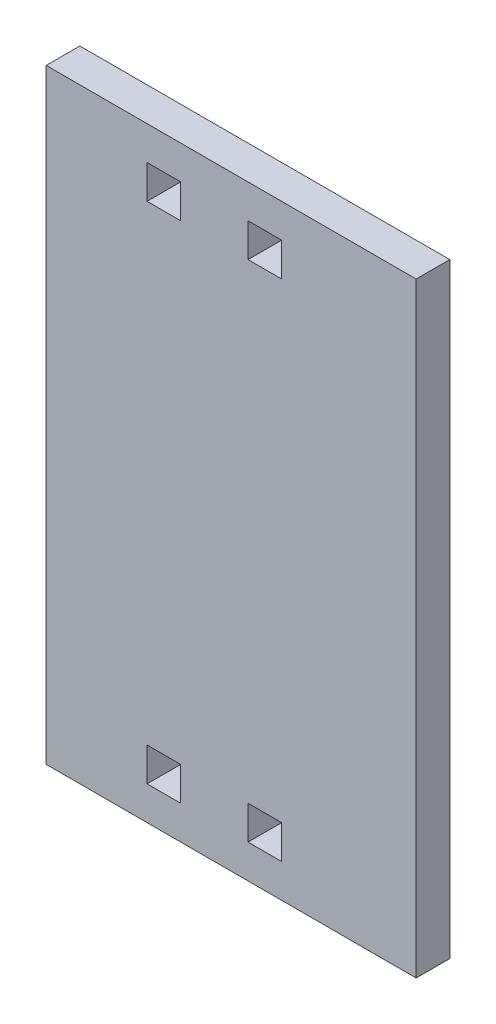
ISO-10303-21;
HEADER;
FILE_DESCRIPTION(('STEP AP214'),'2;1');
FILE_NAME('part.step','',(''),(''),'','','');
FILE_SCHEMA(('AUTOMOTIVE_DESIGN { 1 0 10303 214 1 1 1 1 }'));
ENDSEC;
DATA;
#1=APPLICATION_CONTEXT('core data for automotive mechanical design processes');
#2=APPLICATION_PROTOCOL_DEFINITION('international standard','automotive_design',2000,#1);
#3=PRODUCT_CONTEXT('',#1,'mechanical');
#4=PRODUCT('Part','Part','',(#3));
#5=PRODUCT_RELATED_PRODUCT_CATEGORY('part','',(#4));
#6=PRODUCT_DEFINITION_FORMATION('','',#4);
#7=PRODUCT_DEFINITION_CONTEXT('part definition',#1,'design');
#8=PRODUCT_DEFINITION('design','',#6,#7);
#9=PRODUCT_DEFINITION_SHAPE('','',#8);
#10=(LENGTH_UNIT() NAMED_UNIT(*) SI_UNIT(.MILLI.,.METRE.));
#11=(NAMED_UNIT(*) PLANE_ANGLE_UNIT() SI_UNIT($,.RADIAN.));
#12=(NAMED_UNIT(*) SI_UNIT($,.STERADIAN.) SOLID_ANGLE_UNIT());
#13=UNCERTAINTY_MEASURE_WITH_UNIT(LENGTH_MEASURE(1.E-05),#10,'distance_accuracy_value','');
#14=(GEOMETRIC_REPRESENTATION_CONTEXT(3) GLOBAL_UNCERTAINTY_ASSIGNED_CONTEXT((#13)) GLOBAL_UNIT_ASSIGNED_CONTEXT((#10,
#11,#12)) REPRESENTATION_CONTEXT('',''));
#15=CARTESIAN_POINT('',(0.,0.,0.));
#16=DIRECTION('',(0.,0.,1.));
#17=DIRECTION('',(1.,0.,0.));
#18=AXIS2_PLACEMENT_3D('',#15,#16,#17);
#19=CARTESIAN_POINT('',(0.,72.5,5.));
#20=DIRECTION('',(0.,-1.,0.));
#21=DIRECTION('',(0.,0.,-1.));
#22=AXIS2_PLACEMENT_3D('',#19,#20,#21);
#23=PLANE('',#22);
#24=DIRECTION('',(-1.,0.,0.));
#25=VECTOR('',#24,1.);
#26=CARTESIAN_POINT('',(0.,72.5,0.));
#27=LINE('',#26,#25);
#28=CARTESIAN_POINT('',(-5.,72.5,0.));
#29=VERTEX_POINT('',#28);
#30=CARTESIAN_POINT('',(-10.,72.5,0.));
#31=VERTEX_POINT('',#30);
#32=EDGE_CURVE('E254',#29,#31,#27,.T.);
#33=ORIENTED_EDGE('',*,*,#32,.T.);
#34=DIRECTION('',(0.,0.,-1.));
#35=VECTOR('',#34,1.);
#36=CARTESIAN_POINT('',(-10.,72.5,5.));
#37=LINE('',#36,#35);
#38=CARTESIAN_POINT('',(-10.,72.5,5.));
#39=VERTEX_POINT('',#38);
#40=EDGE_CURVE('E11',#39,#31,#37,.T.);
#41=ORIENTED_EDGE('',*,*,#40,.F.);
#42=DIRECTION('',(-1.,0.,0.));
#43=VECTOR('',#42,1.);
#44=CARTESIAN_POINT('',(0.,72.5,5.));
#45=LINE('',#44,#43);
#46=CARTESIAN_POINT('',(-5.,72.5,5.));
#47=VERTEX_POINT('',#46);
#48=EDGE_CURVE('E190',#47,#39,#45,.T.);
#49=ORIENTED_EDGE('',*,*,#48,.F.);
#50=DIRECTION('',(0.,0.,-1.));
#51=VECTOR('',#50,1.);
#52=CARTESIAN_POINT('',(-5.,72.5,5.));
#53=LINE('',#52,#51);
#54=EDGE_CURVE('E58',#47,#29,#53,.T.);
#55=ORIENTED_EDGE('',*,*,#54,.T.);
#56=EDGE_LOOP('',(#33,#41,#49,#55));
#57=FACE_BOUND('',#56,.T.);
#58=ADVANCED_FACE('F39',(#57),#23,.F.);
#59=CARTESIAN_POINT('',(-10.,0.,5.));
#60=DIRECTION('',(-1.,0.,0.));
#61=DIRECTION('',(0.,0.,1.));
#62=AXIS2_PLACEMENT_3D('',#59,#60,#61);
#63=PLANE('',#62);
#64=DIRECTION('',(0.,1.,0.));
#65=VECTOR('',#64,1.);
#66=CARTESIAN_POINT('',(-10.,0.,0.));
#67=LINE('',#66,#65);
#68=CARTESIAN_POINT('',(-10.,77.5,0.));
#69=VERTEX_POINT('',#68);
#70=EDGE_CURVE('E196',#31,#69,#67,.T.);
#71=ORIENTED_EDGE('',*,*,#70,.T.);
#72=DIRECTION('',(0.,0.,-1.));
#73=VECTOR('',#72,1.);
#74=CARTESIAN_POINT('',(-10.,77.5,5.));
#75=LINE('',#74,#73);
#76=CARTESIAN_POINT('',(-10.,77.5,5.));
#77=VERTEX_POINT('',#76);
#78=EDGE_CURVE('E49',#77,#69,#75,.T.);
#79=ORIENTED_EDGE('',*,*,#78,.F.);
#80=DIRECTION('',(0.,1.,0.));
#81=VECTOR('',#80,1.);
#82=CARTESIAN_POINT('',(-10.,0.,5.));
#83=LINE('',#82,#81);
#84=EDGE_CURVE('E184',#39,#77,#83,.T.);
#85=ORIENTED_EDGE('',*,*,#84,.F.);
#86=ORIENTED_EDGE('',*,*,#40,.T.);
#87=EDGE_LOOP('',(#71,#79,#85,#86));
#88=FACE_BOUND('',#87,.T.);
#89=ADVANCED_FACE('F195',(#88),#63,.F.);
#90=CARTESIAN_POINT('',(0.,77.5,5.));
#91=DIRECTION('',(0.,-1.,0.));
#92=DIRECTION('',(0.,0.,-1.));
#93=AXIS2_PLACEMENT_3D('',#90,#91,#92);
#94=PLANE('',#93);
#95=DIRECTION('',(-1.,0.,0.));
#96=VECTOR('',#95,1.);
#97=CARTESIAN_POINT('',(0.,77.5,0.));
#98=LINE('',#97,#96);
#99=CARTESIAN_POINT('',(-5.,77.5,0.));
#100=VERTEX_POINT('',#99);
#101=EDGE_CURVE('E257',#100,#69,#98,.T.);
#102=ORIENTED_EDGE('',*,*,#101,.F.);
#103=DIRECTION('',(0.,0.,-1.));
#104=VECTOR('',#103,1.);
#105=CARTESIAN_POINT('',(-5.,77.5,5.));
#106=LINE('',#105,#104);
#107=CARTESIAN_POINT('',(-5.,77.5,5.));
#108=VERTEX_POINT('',#107);
#109=EDGE_CURVE('E120',#108,#100,#106,.T.);
#110=ORIENTED_EDGE('',*,*,#109,.F.);
#111=DIRECTION('',(-1.,0.,0.));
#112=VECTOR('',#111,1.);
#113=CARTESIAN_POINT('',(0.,77.5,5.));
#114=LINE('',#113,#112);
#115=EDGE_CURVE('E189',#108,#77,#114,.T.);
#116=ORIENTED_EDGE('',*,*,#115,.T.);
#117=ORIENTED_EDGE('',*,*,#78,.T.);
#118=EDGE_LOOP('',(#102,#110,#116,#117));
#119=FACE_BOUND('',#118,.T.);
#120=ADVANCED_FACE('F200',(#119),#94,.T.);
#121=CARTESIAN_POINT('',(0.,2.5,5.));
#122=DIRECTION('',(0.,1.,0.));
#123=DIRECTION('',(0.,0.,1.));
#124=AXIS2_PLACEMENT_3D('',#121,#122,#123);
#125=PLANE('',#124);
#126=DIRECTION('',(1.,0.,0.));
#127=VECTOR('',#126,1.);
#128=CARTESIAN_POINT('',(0.,2.5,0.));
#129=LINE('',#128,#127);
#130=CARTESIAN_POINT('',(5.,2.5,0.));
#131=VERTEX_POINT('',#130);
#132=CARTESIAN_POINT('',(10.,2.5,0.));
#133=VERTEX_POINT('',#132);
#134=EDGE_CURVE('E242',#131,#133,#129,.T.);
#135=ORIENTED_EDGE('',*,*,#134,.T.);
#136=DIRECTION('',(0.,0.,-1.));
#137=VECTOR('',#136,1.);
#138=CARTESIAN_POINT('',(10.,2.5,5.));
#139=LINE('',#138,#137);
#140=CARTESIAN_POINT('',(10.,2.5,5.));
#141=VERTEX_POINT('',#140);
#142=EDGE_CURVE('E264',#141,#133,#139,.T.);
#143=ORIENTED_EDGE('',*,*,#142,.F.);
#144=DIRECTION('',(1.,0.,0.));
#145=VECTOR('',#144,1.);
#146=CARTESIAN_POINT('',(0.,2.5,5.));
#147=LINE('',#146,#145);
#148=CARTESIAN_POINT('',(5.,2.5,5.));
#149=VERTEX_POINT('',#148);
#150=EDGE_CURVE('E343',#149,#141,#147,.T.);
#151=ORIENTED_EDGE('',*,*,#150,.F.);
#152=DIRECTION('',(0.,0.,-1.));
#153=VECTOR('',#152,1.);
#154=CARTESIAN_POINT('',(5.,2.5,5.));
#155=LINE('',#154,#153);
#156=EDGE_CURVE('E266',#149,#131,#155,.T.);
#157=ORIENTED_EDGE('',*,*,#156,.T.);
#158=EDGE_LOOP('',(#135,#143,#151,#157));
#159=FACE_BOUND('',#158,.T.);
#160=ADVANCED_FACE('F369',(#159),#125,.F.);
#161=CARTESIAN_POINT('',(10.,0.,5.));
#162=DIRECTION('',(1.,0.,0.));
#163=DIRECTION('',(0.,0.,-1.));
#164=AXIS2_PLACEMENT_3D('',#161,#162,#163);
#165=PLANE('',#164);
#166=DIRECTION('',(0.,-1.,0.));
#167=VECTOR('',#166,1.);
#168=CARTESIAN_POINT('',(10.,0.,0.));
#169=LINE('',#168,#167);
#170=CARTESIAN_POINT('',(10.,-2.5,0.));
#171=VERTEX_POINT('',#170);
#172=EDGE_CURVE('E245',#133,#171,#169,.T.);
#173=ORIENTED_EDGE('',*,*,#172,.T.);
#174=DIRECTION('',(0.,0.,-1.));
#175=VECTOR('',#174,1.);
#176=CARTESIAN_POINT('',(10.,-2.5,5.));
#177=LINE('',#176,#175);
#178=CARTESIAN_POINT('',(10.,-2.5,5.));
#179=VERTEX_POINT('',#178);
#180=EDGE_CURVE('E271',#179,#171,#177,.T.);
#181=ORIENTED_EDGE('',*,*,#180,.F.);
#182=DIRECTION('',(0.,-1.,0.));
#183=VECTOR('',#182,1.);
#184=CARTESIAN_POINT('',(10.,0.,5.));
#185=LINE('',#184,#183);
#186=EDGE_CURVE('E346',#141,#179,#185,.T.);
#187=ORIENTED_EDGE('',*,*,#186,.F.);
#188=ORIENTED_EDGE('',*,*,#142,.T.);
#189=EDGE_LOOP('',(#173,#181,#187,#188));
#190=FACE_BOUND('',#189,.T.);
#191=ADVANCED_FACE('F371',(#190),#165,.F.);
#192=CARTESIAN_POINT('',(0.,-2.5,5.));
#193=DIRECTION('',(0.,1.,0.));
#194=DIRECTION('',(0.,0.,1.));
#195=AXIS2_PLACEMENT_3D('',#192,#193,#194);
#196=PLANE('',#195);
#197=DIRECTION('',(1.,0.,0.));
#198=VECTOR('',#197,1.);
#199=CARTESIAN_POINT('',(0.,-2.5,0.));
#200=LINE('',#199,#198);
#201=CARTESIAN_POINT('',(5.,-2.5,0.));
#202=VERTEX_POINT('',#201);
#203=EDGE_CURVE('E248',#202,#171,#200,.T.);
#204=ORIENTED_EDGE('',*,*,#203,.F.);
#205=DIRECTION('',(0.,0.,-1.));
#206=VECTOR('',#205,1.);
#207=CARTESIAN_POINT('',(5.,-2.5,5.));
#208=LINE('',#207,#206);
#209=CARTESIAN_POINT('',(5.,-2.5,5.));
#210=VERTEX_POINT('',#209);
#211=EDGE_CURVE('E268',#210,#202,#208,.T.);
#212=ORIENTED_EDGE('',*,*,#211,.F.);
#213=DIRECTION('',(1.,0.,0.));
#214=VECTOR('',#213,1.);
#215=CARTESIAN_POINT('',(0.,-2.5,5.));
#216=LINE('',#215,#214);
#217=EDGE_CURVE('E348',#210,#179,#216,.T.);
#218=ORIENTED_EDGE('',*,*,#217,.T.);
#219=ORIENTED_EDGE('',*,*,#180,.T.);
#220=EDGE_LOOP('',(#204,#212,#218,#219));
#221=FACE_BOUND('',#220,.T.);
#222=ADVANCED_FACE('F364',(#221),#196,.T.);
#223=CARTESIAN_POINT('',(0.,-7.5,5.));
#224=DIRECTION('',(0.,-1.,0.));
#225=DIRECTION('',(1.,0.,0.));
#226=AXIS2_PLACEMENT_3D('',#223,#224,#225);
#227=PLANE('',#226);
#228=DIRECTION('',(-1.,0.,0.));
#229=VECTOR('',#228,1.);
#230=CARTESIAN_POINT('',(0.,-7.5,0.));
#231=LINE('',#230,#229);
#232=CARTESIAN_POINT('',(30.,-7.5,0.));
#233=VERTEX_POINT('',#232);
#234=CARTESIAN_POINT('',(-25.,-7.50000000000001,0.));
#235=VERTEX_POINT('',#234);
#236=EDGE_CURVE('E230',#233,#235,#231,.T.);
#237=ORIENTED_EDGE('',*,*,#236,.F.);
#238=DIRECTION('',(0.,0.,-1.));
#239=VECTOR('',#238,1.);
#240=CARTESIAN_POINT('',(30.,-7.5,5.));
#241=LINE('',#240,#239);
#242=CARTESIAN_POINT('',(30.,-7.5,5.));
#243=VERTEX_POINT('',#242);
#244=EDGE_CURVE('E269',#243,#233,#241,.T.);
#245=ORIENTED_EDGE('',*,*,#244,.F.);
#246=DIRECTION('',(-1.,0.,0.));
#247=VECTOR('',#246,1.);
#248=CARTESIAN_POINT('',(0.,-7.5,5.));
#249=LINE('',#248,#247);
#250=CARTESIAN_POINT('',(-25.,-7.50000000000001,5.));
#251=VERTEX_POINT('',#250);
#252=EDGE_CURVE('E332',#243,#251,#249,.T.);
#253=ORIENTED_EDGE('',*,*,#252,.T.);
#254=DIRECTION('',(0.,0.,-1.));
#255=VECTOR('',#254,1.);
#256=CARTESIAN_POINT('',(-25.,-7.50000000000001,5.));
#257=LINE('',#256,#255);
#258=EDGE_CURVE('E275',#251,#235,#257,.T.);
#259=ORIENTED_EDGE('',*,*,#258,.T.);
#260=EDGE_LOOP('',(#237,#245,#253,#259));
#261=FACE_BOUND('',#260,.T.);
#262=ADVANCED_FACE('F378',(#261),#227,.T.);
#263=CARTESIAN_POINT('',(30.,0.,5.));
#264=DIRECTION('',(1.,0.,0.));
#265=DIRECTION('',(0.,0.,-1.));
#266=AXIS2_PLACEMENT_3D('',#263,#264,#265);
#267=PLANE('',#266);
#268=DIRECTION('',(0.,-1.,0.));
#269=VECTOR('',#268,1.);
#270=CARTESIAN_POINT('',(30.,0.,0.));
#271=LINE('',#270,#269);
#272=CARTESIAN_POINT('',(30.,82.5,0.));
#273=VERTEX_POINT('',#272);
#274=EDGE_CURVE('E233',#273,#233,#271,.T.);
#275=ORIENTED_EDGE('',*,*,#274,.F.);
#276=DIRECTION('',(0.,0.,-1.));
#277=VECTOR('',#276,1.);
#278=CARTESIAN_POINT('',(30.,82.5,5.));
#279=LINE('',#278,#277);
#280=CARTESIAN_POINT('',(30.,82.5,5.));
#281=VERTEX_POINT('',#280);
#282=EDGE_CURVE('E280',#281,#273,#279,.T.);
#283=ORIENTED_EDGE('',*,*,#282,.F.);
#284=DIRECTION('',(0.,-1.,0.));
#285=VECTOR('',#284,1.);
#286=CARTESIAN_POINT('',(30.,0.,5.));
#287=LINE('',#286,#285);
#288=EDGE_CURVE('E335',#281,#243,#287,.T.);
#289=ORIENTED_EDGE('',*,*,#288,.T.);
#290=ORIENTED_EDGE('',*,*,#244,.T.);
#291=EDGE_LOOP('',(#275,#283,#289,#290));
#292=FACE_BOUND('',#291,.T.);
#293=ADVANCED_FACE('F424',(#292),#267,.T.);
#294=CARTESIAN_POINT('',(0.,82.5,5.));
#295=DIRECTION('',(0.,1.,0.));
#296=DIRECTION('',(0.,0.,1.));
#297=AXIS2_PLACEMENT_3D('',#294,#295,#296);
#298=PLANE('',#297);
#299=DIRECTION('',(1.,0.,0.));
#300=VECTOR('',#299,1.);
#301=CARTESIAN_POINT('',(0.,82.5,0.));
#302=LINE('',#301,#300);
#303=CARTESIAN_POINT('',(-25.,82.5,0.));
#304=VERTEX_POINT('',#303);
#305=EDGE_CURVE('E236',#304,#273,#302,.T.);
#306=ORIENTED_EDGE('',*,*,#305,.F.);
#307=DIRECTION('',(0.,0.,-1.));
#308=VECTOR('',#307,1.);
#309=CARTESIAN_POINT('',(-25.,82.5,5.));
#310=LINE('',#309,#308);
#311=CARTESIAN_POINT('',(-25.,82.5,5.));
#312=VERTEX_POINT('',#311);
#313=EDGE_CURVE('E277',#312,#304,#310,.T.);
#314=ORIENTED_EDGE('',*,*,#313,.F.);
#315=DIRECTION('',(1.,0.,0.));
#316=VECTOR('',#315,1.);
#317=CARTESIAN_POINT('',(0.,82.5,5.));
#318=LINE('',#317,#316);
#319=EDGE_CURVE('E338',#312,#281,#318,.T.);
#320=ORIENTED_EDGE('',*,*,#319,.T.);
#321=ORIENTED_EDGE('',*,*,#282,.T.);
#322=EDGE_LOOP('',(#306,#314,#320,#321));
#323=FACE_BOUND('',#322,.T.);
#324=ADVANCED_FACE('F410',(#323),#298,.T.);
#325=CARTESIAN_POINT('',(-10.,0.,5.));
#326=DIRECTION('',(1.,0.,0.));
#327=DIRECTION('',(0.,0.,-1.));
#328=AXIS2_PLACEMENT_3D('',#325,#326,#327);
#329=PLANE('',#328);
#330=DIRECTION('',(0.,-1.,0.));
#331=VECTOR('',#330,1.);
#332=CARTESIAN_POINT('',(-10.,0.,0.));
#333=LINE('',#332,#331);
#334=CARTESIAN_POINT('',(-10.,2.5,0.));
#335=VERTEX_POINT('',#334);
#336=CARTESIAN_POINT('',(-10.,-2.5,0.));
#337=VERTEX_POINT('',#336);
#338=EDGE_CURVE('E218',#335,#337,#333,.T.);
#339=ORIENTED_EDGE('',*,*,#338,.F.);
#340=DIRECTION('',(0.,0.,-1.));
#341=VECTOR('',#340,1.);
#342=CARTESIAN_POINT('',(-10.,2.5,5.));
#343=LINE('',#342,#341);
#344=CARTESIAN_POINT('',(-10.,2.5,5.));
#345=VERTEX_POINT('',#344);
#346=EDGE_CURVE('E278',#345,#335,#343,.T.);
#347=ORIENTED_EDGE('',*,*,#346,.F.);
#348=DIRECTION('',(0.,-1.,0.));
#349=VECTOR('',#348,1.);
#350=CARTESIAN_POINT('',(-10.,0.,5.));
#351=LINE('',#350,#349);
#352=CARTESIAN_POINT('',(-10.,-2.5,5.));
#353=VERTEX_POINT('',#352);
#354=EDGE_CURVE('E316',#345,#353,#351,.T.);
#355=ORIENTED_EDGE('',*,*,#354,.T.);
#356=DIRECTION('',(0.,0.,-1.));
#357=VECTOR('',#356,1.);
#358=CARTESIAN_POINT('',(-10.,-2.5,5.));
#359=LINE('',#358,#357);
#360=EDGE_CURVE('E283',#353,#337,#359,.T.);
#361=ORIENTED_EDGE('',*,*,#360,.T.);
#362=EDGE_LOOP('',(#339,#347,#355,#361));
#363=FACE_BOUND('',#362,.T.);
#364=ADVANCED_FACE('F406',(#363),#329,.T.);
#365=CARTESIAN_POINT('',(0.,2.5,5.));
#366=DIRECTION('',(0.,-1.,0.));
#367=DIRECTION('',(1.,0.,0.));
#368=AXIS2_PLACEMENT_3D('',#365,#366,#367);
#369=PLANE('',#368);
#370=DIRECTION('',(-1.,0.,0.));
#371=VECTOR('',#370,1.);
#372=CARTESIAN_POINT('',(0.,2.5,0.));
#373=LINE('',#372,#371);
#374=CARTESIAN_POINT('',(-5.,2.5,0.));
#375=VERTEX_POINT('',#374);
#376=EDGE_CURVE('E221',#375,#335,#373,.T.);
#377=ORIENTED_EDGE('',*,*,#376,.F.);
#378=DIRECTION('',(0.,0.,-1.));
#379=VECTOR('',#378,1.);
#380=CARTESIAN_POINT('',(-5.,2.5,5.));
#381=LINE('',#380,#379);
#382=CARTESIAN_POINT('',(-5.,2.5,5.));
#383=VERTEX_POINT('',#382);
#384=EDGE_CURVE('E288',#383,#375,#381,.T.);
#385=ORIENTED_EDGE('',*,*,#384,.F.);
#386=DIRECTION('',(-1.,0.,0.));
#387=VECTOR('',#386,1.);
#388=CARTESIAN_POINT('',(0.,2.5,5.));
#389=LINE('',#388,#387);
#390=EDGE_CURVE('E320',#383,#345,#389,.T.);
#391=ORIENTED_EDGE('',*,*,#390,.T.);
#392=ORIENTED_EDGE('',*,*,#346,.T.);
#393=EDGE_LOOP('',(#377,#385,#391,#392));
#394=FACE_BOUND('',#393,.T.);
#395=ADVANCED_FACE('F409',(#394),#369,.T.);
#396=CARTESIAN_POINT('',(-5.,0.,5.));
#397=DIRECTION('',(1.,0.,0.));
#398=DIRECTION('',(0.,0.,-1.));
#399=AXIS2_PLACEMENT_3D('',#396,#397,#398);
#400=PLANE('',#399);
#401=DIRECTION('',(0.,-1.,0.));
#402=VECTOR('',#401,1.);
#403=CARTESIAN_POINT('',(-5.,0.,0.));
#404=LINE('',#403,#402);
#405=CARTESIAN_POINT('',(-5.,-2.5,0.));
#406=VERTEX_POINT('',#405);
#407=EDGE_CURVE('E224',#375,#406,#404,.T.);
#408=ORIENTED_EDGE('',*,*,#407,.T.);
#409=DIRECTION('',(0.,0.,-1.));
#410=VECTOR('',#409,1.);
#411=CARTESIAN_POINT('',(-5.,-2.5,5.));
#412=LINE('',#411,#410);
#413=CARTESIAN_POINT('',(-5.,-2.5,5.));
#414=VERTEX_POINT('',#413);
#415=EDGE_CURVE('E285',#414,#406,#412,.T.);
#416=ORIENTED_EDGE('',*,*,#415,.F.);
#417=DIRECTION('',(0.,-1.,0.));
#418=VECTOR('',#417,1.);
#419=CARTESIAN_POINT('',(-5.,0.,5.));
#420=LINE('',#419,#418);
#421=EDGE_CURVE('E327',#383,#414,#420,.T.);
#422=ORIENTED_EDGE('',*,*,#421,.F.);
#423=ORIENTED_EDGE('',*,*,#384,.T.);
#424=EDGE_LOOP('',(#408,#416,#422,#423));
#425=FACE_BOUND('',#424,.T.);
#426=ADVANCED_FACE('F414',(#425),#400,.F.);
#427=CARTESIAN_POINT('',(10.,0.,5.));
#428=DIRECTION('',(-1.,0.,0.));
#429=DIRECTION('',(0.,0.,1.));
#430=AXIS2_PLACEMENT_3D('',#427,#428,#429);
#431=PLANE('',#430);
#432=DIRECTION('',(0.,1.,0.));
#433=VECTOR('',#432,1.);
#434=CARTESIAN_POINT('',(10.,0.,0.));
#435=LINE('',#434,#433);
#436=CARTESIAN_POINT('',(10.,72.5,0.));
#437=VERTEX_POINT('',#436);
#438=CARTESIAN_POINT('',(10.,77.5,0.));
#439=VERTEX_POINT('',#438);
#440=EDGE_CURVE('E207',#437,#439,#435,.T.);
#441=ORIENTED_EDGE('',*,*,#440,.F.);
#442=DIRECTION('',(0.,0.,-1.));
#443=VECTOR('',#442,1.);
#444=CARTESIAN_POINT('',(10.,72.5,5.));
#445=LINE('',#444,#443);
#446=CARTESIAN_POINT('',(10.,72.5,5.));
#447=VERTEX_POINT('',#446);
#448=EDGE_CURVE('E43',#447,#437,#445,.T.);
#449=ORIENTED_EDGE('',*,*,#448,.F.);
#450=DIRECTION('',(0.,1.,0.));
#451=VECTOR('',#450,1.);
#452=CARTESIAN_POINT('',(10.,0.,5.));
#453=LINE('',#452,#451);
#454=CARTESIAN_POINT('',(10.,77.5,5.));
#455=VERTEX_POINT('',#454);
#456=EDGE_CURVE('E262',#447,#455,#453,.T.);
#457=ORIENTED_EDGE('',*,*,#456,.T.);
#458=DIRECTION('',(0.,0.,-1.));
#459=VECTOR('',#458,1.);
#460=CARTESIAN_POINT('',(10.,77.5,5.));
#461=LINE('',#460,#459);
#462=EDGE_CURVE('E203',#455,#439,#461,.T.);
#463=ORIENTED_EDGE('',*,*,#462,.T.);
#464=EDGE_LOOP('',(#441,#449,#457,#463));
#465=FACE_BOUND('',#464,.T.);
#466=ADVANCED_FACE('F41',(#465),#431,.T.);
#467=CARTESIAN_POINT('',(0.,72.5,5.));
#468=DIRECTION('',(0.,1.,0.));
#469=DIRECTION('',(0.,0.,1.));
#470=AXIS2_PLACEMENT_3D('',#467,#468,#469);
#471=PLANE('',#470);
#472=DIRECTION('',(1.,0.,0.));
#473=VECTOR('',#472,1.);
#474=CARTESIAN_POINT('',(0.,72.5,0.));
#475=LINE('',#474,#473);
#476=CARTESIAN_POINT('',(5.,72.5,0.));
#477=VERTEX_POINT('',#476);
#478=EDGE_CURVE('E210',#477,#437,#475,.T.);
#479=ORIENTED_EDGE('',*,*,#478,.F.);
#480=DIRECTION('',(0.,0.,-1.));
#481=VECTOR('',#480,1.);
#482=CARTESIAN_POINT('',(5.,72.5,5.));
#483=LINE('',#482,#481);
#484=CARTESIAN_POINT('',(5.,72.5,5.));
#485=VERTEX_POINT('',#484);
#486=EDGE_CURVE('E294',#485,#477,#483,.T.);
#487=ORIENTED_EDGE('',*,*,#486,.F.);
#488=DIRECTION('',(1.,0.,0.));
#489=VECTOR('',#488,1.);
#490=CARTESIAN_POINT('',(0.,72.5,5.));
#491=LINE('',#490,#489);
#492=EDGE_CURVE('E303',#485,#447,#491,.T.);
#493=ORIENTED_EDGE('',*,*,#492,.T.);
#494=ORIENTED_EDGE('',*,*,#448,.T.);
#495=EDGE_LOOP('',(#479,#487,#493,#494));
#496=FACE_BOUND('',#495,.T.);
#497=ADVANCED_FACE('F301',(#496),#471,.T.);
#498=CARTESIAN_POINT('',(5.,0.,5.));
#499=DIRECTION('',(-1.,0.,0.));
#500=DIRECTION('',(0.,0.,1.));
#501=AXIS2_PLACEMENT_3D('',#498,#499,#500);
#502=PLANE('',#501);
#503=DIRECTION('',(0.,1.,0.));
#504=VECTOR('',#503,1.);
#505=CARTESIAN_POINT('',(5.,0.,0.));
#506=LINE('',#505,#504);
#507=CARTESIAN_POINT('',(5.,77.5,0.));
#508=VERTEX_POINT('',#507);
#509=EDGE_CURVE('E213',#477,#508,#506,.T.);
#510=ORIENTED_EDGE('',*,*,#509,.T.);
#511=DIRECTION('',(0.,0.,-1.));
#512=VECTOR('',#511,1.);
#513=CARTESIAN_POINT('',(5.,77.5,5.));
#514=LINE('',#513,#512);
#515=CARTESIAN_POINT('',(5.,77.5,5.));
#516=VERTEX_POINT('',#515);
#517=EDGE_CURVE('E292',#516,#508,#514,.T.);
#518=ORIENTED_EDGE('',*,*,#517,.F.);
#519=DIRECTION('',(0.,1.,0.));
#520=VECTOR('',#519,1.);
#521=CARTESIAN_POINT('',(5.,0.,5.));
#522=LINE('',#521,#520);
#523=EDGE_CURVE('E317',#485,#516,#522,.T.);
#524=ORIENTED_EDGE('',*,*,#523,.F.);
#525=ORIENTED_EDGE('',*,*,#486,.T.);
#526=EDGE_LOOP('',(#510,#518,#524,#525));
#527=FACE_BOUND('',#526,.T.);
#528=ADVANCED_FACE('F310',(#527),#502,.F.);
#529=CARTESIAN_POINT('',(5.,0.,5.));
#530=DIRECTION('',(1.,0.,0.));
#531=DIRECTION('',(0.,0.,-1.));
#532=AXIS2_PLACEMENT_3D('',#529,#530,#531);
#533=PLANE('',#532);
#534=DIRECTION('',(0.,-1.,0.));
#535=VECTOR('',#534,1.);
#536=CARTESIAN_POINT('',(5.,0.,0.));
#537=LINE('',#536,#535);
#538=EDGE_CURVE('E251',#131,#202,#537,.T.);
#539=ORIENTED_EDGE('',*,*,#538,.F.);
#540=ORIENTED_EDGE('',*,*,#156,.F.);
#541=DIRECTION('',(0.,-1.,0.));
#542=VECTOR('',#541,1.);
#543=CARTESIAN_POINT('',(5.,0.,5.));
#544=LINE('',#543,#542);
#545=EDGE_CURVE('E351',#149,#210,#544,.T.);
#546=ORIENTED_EDGE('',*,*,#545,.T.);
#547=ORIENTED_EDGE('',*,*,#211,.T.);
#548=EDGE_LOOP('',(#539,#540,#546,#547));
#549=FACE_BOUND('',#548,.T.);
#550=ADVANCED_FACE('F356',(#549),#533,.T.);
#551=CARTESIAN_POINT('',(-25.,0.,5.));
#552=DIRECTION('',(1.,0.,0.));
#553=DIRECTION('',(0.,1.,0.));
#554=AXIS2_PLACEMENT_3D('',#551,#552,#553);
#555=PLANE('',#554);
#556=DIRECTION('',(0.,-1.,0.));
#557=VECTOR('',#556,1.);
#558=CARTESIAN_POINT('',(-25.,0.,0.));
#559=LINE('',#558,#557);
#560=EDGE_CURVE('E239',#304,#235,#559,.T.);
#561=ORIENTED_EDGE('',*,*,#560,.T.);
#562=ORIENTED_EDGE('',*,*,#258,.F.);
#563=DIRECTION('',(0.,-1.,0.));
#564=VECTOR('',#563,1.);
#565=CARTESIAN_POINT('',(-25.,0.,5.));
#566=LINE('',#565,#564);
#567=EDGE_CURVE('E341',#312,#251,#566,.T.);
#568=ORIENTED_EDGE('',*,*,#567,.F.);
#569=ORIENTED_EDGE('',*,*,#313,.T.);
#570=EDGE_LOOP('',(#561,#562,#568,#569));
#571=FACE_BOUND('',#570,.T.);
#572=ADVANCED_FACE('F390',(#571),#555,.F.);
#573=CARTESIAN_POINT('',(0.,-2.5,5.));
#574=DIRECTION('',(0.,-1.,0.));
#575=DIRECTION('',(1.,0.,0.));
#576=AXIS2_PLACEMENT_3D('',#573,#574,#575);
#577=PLANE('',#576);
#578=DIRECTION('',(-1.,0.,0.));
#579=VECTOR('',#578,1.);
#580=CARTESIAN_POINT('',(0.,-2.5,0.));
#581=LINE('',#580,#579);
#582=EDGE_CURVE('E227',#406,#337,#581,.T.);
#583=ORIENTED_EDGE('',*,*,#582,.T.);
#584=ORIENTED_EDGE('',*,*,#360,.F.);
#585=DIRECTION('',(-1.,0.,0.));
#586=VECTOR('',#585,1.);
#587=CARTESIAN_POINT('',(0.,-2.5,5.));
#588=LINE('',#587,#586);
#589=EDGE_CURVE('E330',#414,#353,#588,.T.);
#590=ORIENTED_EDGE('',*,*,#589,.F.);
#591=ORIENTED_EDGE('',*,*,#415,.T.);
#592=EDGE_LOOP('',(#583,#584,#590,#591));
#593=FACE_BOUND('',#592,.T.);
#594=ADVANCED_FACE('F395',(#593),#577,.F.);
#595=CARTESIAN_POINT('',(0.,77.5,5.));
#596=DIRECTION('',(0.,1.,0.));
#597=DIRECTION('',(0.,0.,1.));
#598=AXIS2_PLACEMENT_3D('',#595,#596,#597);
#599=PLANE('',#598);
#600=DIRECTION('',(1.,0.,0.));
#601=VECTOR('',#600,1.);
#602=CARTESIAN_POINT('',(0.,77.5,0.));
#603=LINE('',#602,#601);
#604=EDGE_CURVE('E215',#508,#439,#603,.T.);
#605=ORIENTED_EDGE('',*,*,#604,.T.);
#606=ORIENTED_EDGE('',*,*,#462,.F.);
#607=DIRECTION('',(1.,0.,0.));
#608=VECTOR('',#607,1.);
#609=CARTESIAN_POINT('',(0.,77.5,5.));
#610=LINE('',#609,#608);
#611=EDGE_CURVE('E314',#516,#455,#610,.T.);
#612=ORIENTED_EDGE('',*,*,#611,.F.);
#613=ORIENTED_EDGE('',*,*,#517,.T.);
#614=EDGE_LOOP('',(#605,#606,#612,#613));
#615=FACE_BOUND('',#614,.T.);
#616=ADVANCED_FACE('F313',(#615),#599,.F.);
#617=CARTESIAN_POINT('',(-5.,0.,5.));
#618=DIRECTION('',(-1.,0.,0.));
#619=DIRECTION('',(0.,0.,1.));
#620=AXIS2_PLACEMENT_3D('',#617,#618,#619);
#621=PLANE('',#620);
#622=DIRECTION('',(0.,1.,0.));
#623=VECTOR('',#622,1.);
#624=CARTESIAN_POINT('',(-5.,0.,0.));
#625=LINE('',#624,#623);
#626=EDGE_CURVE('E259',#29,#100,#625,.T.);
#627=ORIENTED_EDGE('',*,*,#626,.F.);
#628=ORIENTED_EDGE('',*,*,#54,.F.);
#629=DIRECTION('',(0.,1.,0.));
#630=VECTOR('',#629,1.);
#631=CARTESIAN_POINT('',(-5.,0.,5.));
#632=LINE('',#631,#630);
#633=EDGE_CURVE('E201',#47,#108,#632,.T.);
#634=ORIENTED_EDGE('',*,*,#633,.T.);
#635=ORIENTED_EDGE('',*,*,#109,.T.);
#636=EDGE_LOOP('',(#627,#628,#634,#635));
#637=FACE_BOUND('',#636,.T.);
#638=ADVANCED_FACE('F405',(#637),#621,.T.);
#639=CARTESIAN_POINT('',(0.,0.,5.));
#640=DIRECTION('',(0.,0.,1.));
#641=DIRECTION('',(1.,0.,0.));
#642=AXIS2_PLACEMENT_3D('',#639,#640,#641);
#643=PLANE('',#642);
#644=ORIENTED_EDGE('',*,*,#456,.F.);
#645=ORIENTED_EDGE('',*,*,#492,.F.);
#646=ORIENTED_EDGE('',*,*,#523,.T.);
#647=ORIENTED_EDGE('',*,*,#611,.T.);
#648=EDGE_LOOP('',(#644,#645,#646,#647));
#649=FACE_BOUND('',#648,.T.);
#650=ORIENTED_EDGE('',*,*,#354,.F.);
#651=ORIENTED_EDGE('',*,*,#390,.F.);
#652=ORIENTED_EDGE('',*,*,#421,.T.);
#653=ORIENTED_EDGE('',*,*,#589,.T.);
#654=EDGE_LOOP('',(#650,#651,#652,#653));
#655=FACE_BOUND('',#654,.T.);
#656=ORIENTED_EDGE('',*,*,#252,.F.);
#657=ORIENTED_EDGE('',*,*,#288,.F.);
#658=ORIENTED_EDGE('',*,*,#319,.F.);
#659=ORIENTED_EDGE('',*,*,#567,.T.);
#660=EDGE_LOOP('',(#656,#657,#658,#659));
#661=FACE_BOUND('',#660,.T.);
#662=ORIENTED_EDGE('',*,*,#150,.T.);
#663=ORIENTED_EDGE('',*,*,#186,.T.);
#664=ORIENTED_EDGE('',*,*,#217,.F.);
#665=ORIENTED_EDGE('',*,*,#545,.F.);
#666=EDGE_LOOP('',(#662,#663,#664,#665));
#667=FACE_BOUND('',#666,.T.);
#668=ORIENTED_EDGE('',*,*,#48,.T.);
#669=ORIENTED_EDGE('',*,*,#84,.T.);
#670=ORIENTED_EDGE('',*,*,#115,.F.);
#671=ORIENTED_EDGE('',*,*,#633,.F.);
#672=EDGE_LOOP('',(#668,#669,#670,#671));
#673=FACE_BOUND('',#672,.T.);
#674=ADVANCED_FACE('F186',(#649,#655,#661,#667,#673),#643,.T.);
#675=CARTESIAN_POINT('',(0.,0.,0.));
#676=DIRECTION('',(0.,0.,1.));
#677=DIRECTION('',(1.,0.,0.));
#678=AXIS2_PLACEMENT_3D('',#675,#676,#677);
#679=PLANE('',#678);
#680=ORIENTED_EDGE('',*,*,#440,.T.);
#681=ORIENTED_EDGE('',*,*,#604,.F.);
#682=ORIENTED_EDGE('',*,*,#509,.F.);
#683=ORIENTED_EDGE('',*,*,#478,.T.);
#684=EDGE_LOOP('',(#680,#681,#682,#683));
#685=FACE_BOUND('',#684,.T.);
#686=ORIENTED_EDGE('',*,*,#338,.T.);
#687=ORIENTED_EDGE('',*,*,#582,.F.);
#688=ORIENTED_EDGE('',*,*,#407,.F.);
#689=ORIENTED_EDGE('',*,*,#376,.T.);
#690=EDGE_LOOP('',(#686,#687,#688,#689));
#691=FACE_BOUND('',#690,.T.);
#692=ORIENTED_EDGE('',*,*,#236,.T.);
#693=ORIENTED_EDGE('',*,*,#560,.F.);
#694=ORIENTED_EDGE('',*,*,#305,.T.);
#695=ORIENTED_EDGE('',*,*,#274,.T.);
#696=EDGE_LOOP('',(#692,#693,#694,#695));
#697=FACE_BOUND('',#696,.T.);
#698=ORIENTED_EDGE('',*,*,#134,.F.);
#699=ORIENTED_EDGE('',*,*,#538,.T.);
#700=ORIENTED_EDGE('',*,*,#203,.T.);
#701=ORIENTED_EDGE('',*,*,#172,.F.);
#702=EDGE_LOOP('',(#698,#699,#700,#701));
#703=FACE_BOUND('',#702,.T.);
#704=ORIENTED_EDGE('',*,*,#32,.F.);
#705=ORIENTED_EDGE('',*,*,#626,.T.);
#706=ORIENTED_EDGE('',*,*,#101,.T.);
#707=ORIENTED_EDGE('',*,*,#70,.F.);
#708=EDGE_LOOP('',(#704,#705,#706,#707));
#709=FACE_BOUND('',#708,.T.);
#710=ADVANCED_FACE('F307',(#685,#691,#697,#703,#709),#679,.F.);
#711=CLOSED_SHELL('',(#58,#89,#120,#160,#191,#222,#262,#293,#324,#364,#395,#426,#466,#497,#528,
#550,#572,#594,#616,#638,#674,#710));
#712=MANIFOLD_SOLID_BREP('B2',#711);
#713=ADVANCED_BREP_SHAPE_REPRESENTATION('',(#18,#712),#14);
#714=SHAPE_DEFINITION_REPRESENTATION(#9,#713);
ENDSEC;
END-ISO-10303-21;
